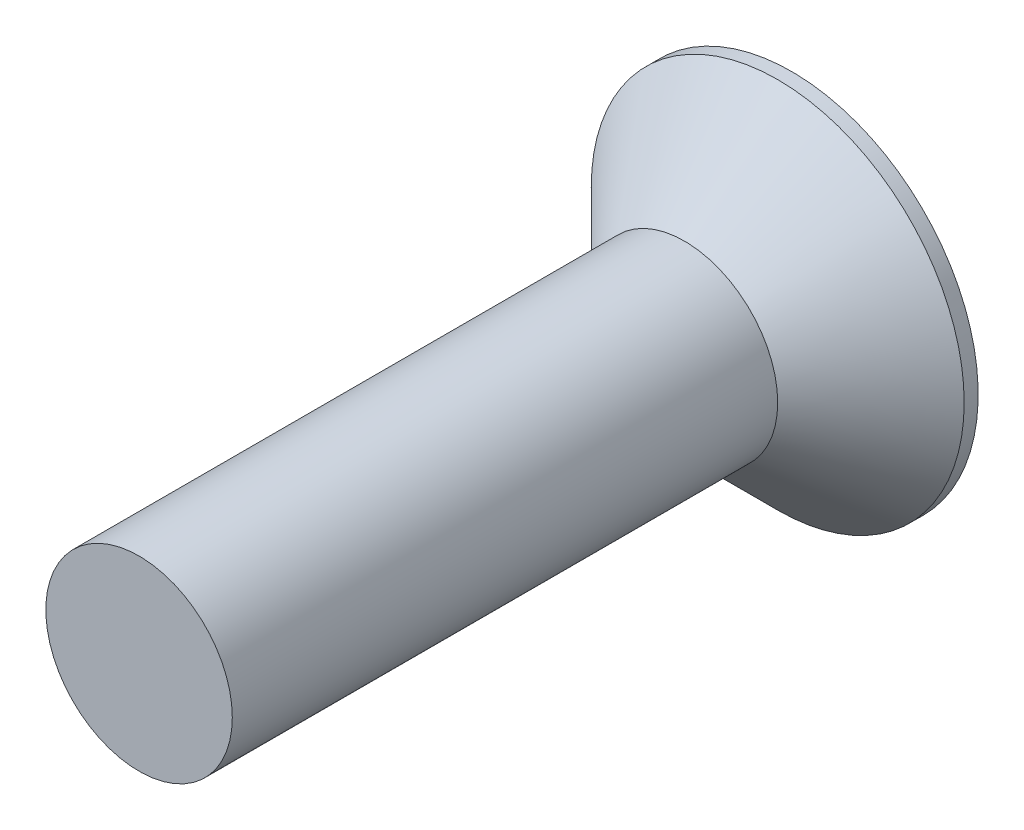
ISO-10303-21;
HEADER;
FILE_DESCRIPTION(('STEP AP214'),'2;1');
FILE_NAME('part.step','',(''),(''),'','','');
FILE_SCHEMA(('AUTOMOTIVE_DESIGN { 1 0 10303 214 1 1 1 1 }'));
ENDSEC;
DATA;
#1=APPLICATION_CONTEXT('core data for automotive mechanical design processes');
#2=APPLICATION_PROTOCOL_DEFINITION('international standard','automotive_design',2000,#1);
#3=PRODUCT_CONTEXT('',#1,'mechanical');
#4=PRODUCT('Part','Part','',(#3));
#5=PRODUCT_RELATED_PRODUCT_CATEGORY('part','',(#4));
#6=PRODUCT_DEFINITION_FORMATION('','',#4);
#7=PRODUCT_DEFINITION_CONTEXT('part definition',#1,'design');
#8=PRODUCT_DEFINITION('design','',#6,#7);
#9=PRODUCT_DEFINITION_SHAPE('','',#8);
#10=(LENGTH_UNIT() NAMED_UNIT(*) SI_UNIT(.MILLI.,.METRE.));
#11=(NAMED_UNIT(*) PLANE_ANGLE_UNIT() SI_UNIT($,.RADIAN.));
#12=(NAMED_UNIT(*) SI_UNIT($,.STERADIAN.) SOLID_ANGLE_UNIT());
#13=UNCERTAINTY_MEASURE_WITH_UNIT(LENGTH_MEASURE(1.E-05),#10,'distance_accuracy_value','');
#14=(GEOMETRIC_REPRESENTATION_CONTEXT(3) GLOBAL_UNCERTAINTY_ASSIGNED_CONTEXT((#13)) GLOBAL_UNIT_ASSIGNED_CONTEXT((#10,
#11,#12)) REPRESENTATION_CONTEXT('',''));
#15=CARTESIAN_POINT('',(0.,0.,0.));
#16=DIRECTION('',(0.,0.,1.));
#17=DIRECTION('',(1.,0.,0.));
#18=AXIS2_PLACEMENT_3D('',#15,#16,#17);
#19=CARTESIAN_POINT('',(0.,0.,-14.));
#20=DIRECTION('',(0.,0.,1.));
#21=DIRECTION('',(1.,0.,0.));
#22=AXIS2_PLACEMENT_3D('',#19,#20,#21);
#23=PLANE('',#22);
#24=CARTESIAN_POINT('',(0.,0.,-14.));
#25=DIRECTION('',(0.,0.,-1.));
#26=DIRECTION('',(-1.,0.,0.));
#27=AXIS2_PLACEMENT_3D('',#24,#25,#26);
#28=CIRCLE('',#27,4.);
#29=CARTESIAN_POINT('',(-4.,0.,-14.));
#30=VERTEX_POINT('',#29);
#31=EDGE_CURVE('E42',#30,#30,#28,.T.);
#32=ORIENTED_EDGE('',*,*,#31,.T.);
#33=EDGE_LOOP('',(#32));
#34=FACE_BOUND('',#33,.T.);
#35=DIRECTION('',(-0.866025403784439,0.5,0.));
#36=VECTOR('',#35,1.);
#37=CARTESIAN_POINT('',(1.25,0.721687836487034,-14.));
#38=LINE('',#37,#36);
#39=CARTESIAN_POINT('',(1.25,0.721687836487034,-14.));
#40=VERTEX_POINT('',#39);
#41=CARTESIAN_POINT('',(0.,1.44337567297406,-14.));
#42=VERTEX_POINT('',#41);
#43=EDGE_CURVE('E49',#40,#42,#38,.T.);
#44=ORIENTED_EDGE('',*,*,#43,.T.);
#45=DIRECTION('',(-0.866025403784439,-0.5,0.));
#46=VECTOR('',#45,1.);
#47=CARTESIAN_POINT('',(0.,1.44337567297406,-14.));
#48=LINE('',#47,#46);
#49=CARTESIAN_POINT('',(-1.25,0.721687836487032,-14.));
#50=VERTEX_POINT('',#49);
#51=EDGE_CURVE('E120',#42,#50,#48,.T.);
#52=ORIENTED_EDGE('',*,*,#51,.T.);
#53=DIRECTION('',(0.,-1.,0.));
#54=VECTOR('',#53,1.);
#55=CARTESIAN_POINT('',(-1.25,0.721687836487032,-14.));
#56=LINE('',#55,#54);
#57=CARTESIAN_POINT('',(-1.25,-0.721687836487032,-14.));
#58=VERTEX_POINT('',#57);
#59=EDGE_CURVE('E123',#50,#58,#56,.T.);
#60=ORIENTED_EDGE('',*,*,#59,.T.);
#61=DIRECTION('',(0.866025403784439,-0.5,0.));
#62=VECTOR('',#61,1.);
#63=CARTESIAN_POINT('',(-1.25,-0.721687836487032,-14.));
#64=LINE('',#63,#62);
#65=CARTESIAN_POINT('',(0.,-1.44337567297406,-14.));
#66=VERTEX_POINT('',#65);
#67=EDGE_CURVE('E126',#58,#66,#64,.T.);
#68=ORIENTED_EDGE('',*,*,#67,.T.);
#69=DIRECTION('',(0.866025403784439,0.5,0.));
#70=VECTOR('',#69,1.);
#71=CARTESIAN_POINT('',(0.,-1.44337567297406,-14.));
#72=LINE('',#71,#70);
#73=CARTESIAN_POINT('',(1.25,-0.721687836487033,-14.));
#74=VERTEX_POINT('',#73);
#75=EDGE_CURVE('E110',#66,#74,#72,.T.);
#76=ORIENTED_EDGE('',*,*,#75,.T.);
#77=DIRECTION('',(0.,1.,0.));
#78=VECTOR('',#77,1.);
#79=CARTESIAN_POINT('',(1.25,-0.721687836487033,-14.));
#80=LINE('',#79,#78);
#81=EDGE_CURVE('E129',#74,#40,#80,.T.);
#82=ORIENTED_EDGE('',*,*,#81,.T.);
#83=EDGE_LOOP('',(#44,#52,#60,#68,#76,#82));
#84=FACE_BOUND('',#83,.T.);
#85=ADVANCED_FACE('F34',(#34,#84),#23,.F.);
#86=CARTESIAN_POINT('',(0.,0.,-11.7));
#87=DIRECTION('',(0.,0.,-1.));
#88=DIRECTION('',(-1.,0.,0.));
#89=AXIS2_PLACEMENT_3D('',#86,#87,#88);
#90=CYLINDRICAL_SURFACE('',#89,4.);
#91=CARTESIAN_POINT('',(0.,0.,-13.7));
#92=DIRECTION('',(0.,0.,1.));
#93=DIRECTION('',(1.,0.,0.));
#94=AXIS2_PLACEMENT_3D('',#91,#92,#93);
#95=CIRCLE('',#94,4.);
#96=CARTESIAN_POINT('',(4.,0.,-13.7));
#97=VERTEX_POINT('',#96);
#98=EDGE_CURVE('E143',#97,#97,#95,.T.);
#99=ORIENTED_EDGE('',*,*,#98,.F.);
#100=EDGE_LOOP('',(#99));
#101=FACE_BOUND('',#100,.T.);
#102=ORIENTED_EDGE('',*,*,#31,.F.);
#103=EDGE_LOOP('',(#102));
#104=FACE_BOUND('',#103,.T.);
#105=ADVANCED_FACE('F150',(#101,#104),#90,.T.);
#106=CARTESIAN_POINT('',(0.,0.,-13.7));
#107=DIRECTION('',(0.,0.,-1.));
#108=DIRECTION('',(-1.,0.,0.));
#109=AXIS2_PLACEMENT_3D('',#106,#107,#108);
#110=CONICAL_SURFACE('',#109,4.,0.785398163397444);
#111=CARTESIAN_POINT('',(0.,0.,-11.7));
#112=DIRECTION('',(0.,0.,1.));
#113=DIRECTION('',(1.,0.,0.));
#114=AXIS2_PLACEMENT_3D('',#111,#112,#113);
#115=CIRCLE('',#114,2.);
#116=CARTESIAN_POINT('',(2.,0.,-11.7));
#117=VERTEX_POINT('',#116);
#118=EDGE_CURVE('E140',#117,#117,#115,.T.);
#119=ORIENTED_EDGE('',*,*,#118,.F.);
#120=EDGE_LOOP('',(#119));
#121=FACE_BOUND('',#120,.T.);
#122=ORIENTED_EDGE('',*,*,#98,.T.);
#123=EDGE_LOOP('',(#122));
#124=FACE_BOUND('',#123,.T.);
#125=ADVANCED_FACE('F152',(#121,#124),#110,.T.);
#126=CARTESIAN_POINT('',(0.,0.,0.));
#127=DIRECTION('',(0.,0.,1.));
#128=DIRECTION('',(1.,0.,0.));
#129=AXIS2_PLACEMENT_3D('',#126,#127,#128);
#130=PLANE('',#129);
#131=CARTESIAN_POINT('',(0.,0.,0.));
#132=DIRECTION('',(0.,0.,1.));
#133=DIRECTION('',(1.,0.,0.));
#134=AXIS2_PLACEMENT_3D('',#131,#132,#133);
#135=CIRCLE('',#134,2.);
#136=CARTESIAN_POINT('',(2.,0.,0.));
#137=VERTEX_POINT('',#136);
#138=EDGE_CURVE('E11',#137,#137,#135,.T.);
#139=ORIENTED_EDGE('',*,*,#138,.T.);
#140=EDGE_LOOP('',(#139));
#141=FACE_BOUND('',#140,.T.);
#142=ADVANCED_FACE('F159',(#141),#130,.T.);
#143=CARTESIAN_POINT('',(0.,0.,-14.));
#144=DIRECTION('',(0.,0.,1.));
#145=DIRECTION('',(1.,0.,0.));
#146=AXIS2_PLACEMENT_3D('',#143,#144,#145);
#147=CYLINDRICAL_SURFACE('',#146,2.);
#148=ORIENTED_EDGE('',*,*,#138,.F.);
#149=EDGE_LOOP('',(#148));
#150=FACE_BOUND('',#149,.T.);
#151=ORIENTED_EDGE('',*,*,#118,.T.);
#152=EDGE_LOOP('',(#151));
#153=FACE_BOUND('',#152,.T.);
#154=ADVANCED_FACE('F36',(#150,#153),#147,.T.);
#155=CARTESIAN_POINT('',(1.25,0.721687836487034,-12.125));
#156=DIRECTION('',(-0.5,-0.866025403784439,0.));
#157=DIRECTION('',(0.866025403784439,-0.5,0.));
#158=AXIS2_PLACEMENT_3D('',#155,#156,#157);
#159=PLANE('',#158);
#160=ORIENTED_EDGE('',*,*,#43,.F.);
#161=DIRECTION('',(0.,0.,-1.));
#162=VECTOR('',#161,1.);
#163=CARTESIAN_POINT('',(1.25,0.721687836487034,-12.125));
#164=LINE('',#163,#162);
#165=CARTESIAN_POINT('',(1.25,0.721687836487034,-12.125));
#166=VERTEX_POINT('',#165);
#167=EDGE_CURVE('E115',#166,#40,#164,.T.);
#168=ORIENTED_EDGE('',*,*,#167,.F.);
#169=DIRECTION('',(-0.866025403784439,0.5,0.));
#170=VECTOR('',#169,1.);
#171=CARTESIAN_POINT('',(1.25,0.721687836487034,-12.125));
#172=LINE('',#171,#170);
#173=CARTESIAN_POINT('',(0.,1.44337567297406,-12.125));
#174=VERTEX_POINT('',#173);
#175=EDGE_CURVE('E132',#166,#174,#172,.T.);
#176=ORIENTED_EDGE('',*,*,#175,.T.);
#177=DIRECTION('',(0.,0.,-1.));
#178=VECTOR('',#177,1.);
#179=CARTESIAN_POINT('',(0.,1.44337567297406,-12.125));
#180=LINE('',#179,#178);
#181=EDGE_CURVE('E138',#174,#42,#180,.T.);
#182=ORIENTED_EDGE('',*,*,#181,.T.);
#183=EDGE_LOOP('',(#160,#168,#176,#182));
#184=FACE_BOUND('',#183,.T.);
#185=ADVANCED_FACE('F170',(#184),#159,.T.);
#186=CARTESIAN_POINT('',(0.,1.44337567297406,-12.125));
#187=DIRECTION('',(0.5,-0.866025403784439,0.));
#188=DIRECTION('',(0.866025403784439,0.5,0.));
#189=AXIS2_PLACEMENT_3D('',#186,#187,#188);
#190=PLANE('',#189);
#191=ORIENTED_EDGE('',*,*,#51,.F.);
#192=ORIENTED_EDGE('',*,*,#181,.F.);
#193=DIRECTION('',(-0.866025403784439,-0.5,0.));
#194=VECTOR('',#193,1.);
#195=CARTESIAN_POINT('',(0.,1.44337567297406,-12.125));
#196=LINE('',#195,#194);
#197=CARTESIAN_POINT('',(-1.25,0.721687836487032,-12.125));
#198=VERTEX_POINT('',#197);
#199=EDGE_CURVE('E88',#174,#198,#196,.T.);
#200=ORIENTED_EDGE('',*,*,#199,.T.);
#201=DIRECTION('',(0.,0.,-1.));
#202=VECTOR('',#201,1.);
#203=CARTESIAN_POINT('',(-1.25,0.721687836487032,-12.125));
#204=LINE('',#203,#202);
#205=EDGE_CURVE('E136',#198,#50,#204,.T.);
#206=ORIENTED_EDGE('',*,*,#205,.T.);
#207=EDGE_LOOP('',(#191,#192,#200,#206));
#208=FACE_BOUND('',#207,.T.);
#209=ADVANCED_FACE('F179',(#208),#190,.T.);
#210=CARTESIAN_POINT('',(-1.25,0.721687836487032,-12.125));
#211=DIRECTION('',(1.,0.,0.));
#212=DIRECTION('',(0.,0.,-1.));
#213=AXIS2_PLACEMENT_3D('',#210,#211,#212);
#214=PLANE('',#213);
#215=ORIENTED_EDGE('',*,*,#59,.F.);
#216=ORIENTED_EDGE('',*,*,#205,.F.);
#217=DIRECTION('',(0.,-1.,0.));
#218=VECTOR('',#217,1.);
#219=CARTESIAN_POINT('',(-1.25,0.721687836487032,-12.125));
#220=LINE('',#219,#218);
#221=CARTESIAN_POINT('',(-1.25,-0.721687836487032,-12.125));
#222=VERTEX_POINT('',#221);
#223=EDGE_CURVE('E106',#198,#222,#220,.T.);
#224=ORIENTED_EDGE('',*,*,#223,.T.);
#225=DIRECTION('',(0.,0.,-1.));
#226=VECTOR('',#225,1.);
#227=CARTESIAN_POINT('',(-1.25,-0.721687836487032,-12.125));
#228=LINE('',#227,#226);
#229=EDGE_CURVE('E103',#222,#58,#228,.T.);
#230=ORIENTED_EDGE('',*,*,#229,.T.);
#231=EDGE_LOOP('',(#215,#216,#224,#230));
#232=FACE_BOUND('',#231,.T.);
#233=ADVANCED_FACE('F183',(#232),#214,.T.);
#234=CARTESIAN_POINT('',(-1.25,-0.721687836487032,-12.125));
#235=DIRECTION('',(0.5,0.866025403784439,0.));
#236=DIRECTION('',(-0.866025403784439,0.5,0.));
#237=AXIS2_PLACEMENT_3D('',#234,#235,#236);
#238=PLANE('',#237);
#239=ORIENTED_EDGE('',*,*,#67,.F.);
#240=ORIENTED_EDGE('',*,*,#229,.F.);
#241=DIRECTION('',(0.866025403784439,-0.5,0.));
#242=VECTOR('',#241,1.);
#243=CARTESIAN_POINT('',(-1.25,-0.721687836487032,-12.125));
#244=LINE('',#243,#242);
#245=CARTESIAN_POINT('',(0.,-1.44337567297406,-12.125));
#246=VERTEX_POINT('',#245);
#247=EDGE_CURVE('E98',#222,#246,#244,.T.);
#248=ORIENTED_EDGE('',*,*,#247,.T.);
#249=DIRECTION('',(0.,0.,-1.));
#250=VECTOR('',#249,1.);
#251=CARTESIAN_POINT('',(0.,-1.44337567297406,-12.125));
#252=LINE('',#251,#250);
#253=EDGE_CURVE('E102',#246,#66,#252,.T.);
#254=ORIENTED_EDGE('',*,*,#253,.T.);
#255=EDGE_LOOP('',(#239,#240,#248,#254));
#256=FACE_BOUND('',#255,.T.);
#257=ADVANCED_FACE('F101',(#256),#238,.T.);
#258=CARTESIAN_POINT('',(0.,-1.44337567297406,-12.125));
#259=DIRECTION('',(-0.5,0.866025403784439,0.));
#260=DIRECTION('',(-0.866025403784439,-0.5,0.));
#261=AXIS2_PLACEMENT_3D('',#258,#259,#260);
#262=PLANE('',#261);
#263=ORIENTED_EDGE('',*,*,#75,.F.);
#264=ORIENTED_EDGE('',*,*,#253,.F.);
#265=DIRECTION('',(0.866025403784439,0.5,0.));
#266=VECTOR('',#265,1.);
#267=CARTESIAN_POINT('',(0.,-1.44337567297406,-12.125));
#268=LINE('',#267,#266);
#269=CARTESIAN_POINT('',(1.25,-0.721687836487033,-12.125));
#270=VERTEX_POINT('',#269);
#271=EDGE_CURVE('E105',#246,#270,#268,.T.);
#272=ORIENTED_EDGE('',*,*,#271,.T.);
#273=DIRECTION('',(0.,0.,-1.));
#274=VECTOR('',#273,1.);
#275=CARTESIAN_POINT('',(1.25,-0.721687836487033,-12.125));
#276=LINE('',#275,#274);
#277=EDGE_CURVE('E79',#270,#74,#276,.T.);
#278=ORIENTED_EDGE('',*,*,#277,.T.);
#279=EDGE_LOOP('',(#263,#264,#272,#278));
#280=FACE_BOUND('',#279,.T.);
#281=ADVANCED_FACE('F108',(#280),#262,.T.);
#282=CARTESIAN_POINT('',(1.25,-0.721687836487033,-12.125));
#283=DIRECTION('',(-1.,0.,0.));
#284=DIRECTION('',(0.,-1.,0.));
#285=AXIS2_PLACEMENT_3D('',#282,#283,#284);
#286=PLANE('',#285);
#287=ORIENTED_EDGE('',*,*,#81,.F.);
#288=ORIENTED_EDGE('',*,*,#277,.F.);
#289=DIRECTION('',(0.,1.,0.));
#290=VECTOR('',#289,1.);
#291=CARTESIAN_POINT('',(1.25,-0.721687836487033,-12.125));
#292=LINE('',#291,#290);
#293=EDGE_CURVE('E57',#270,#166,#292,.T.);
#294=ORIENTED_EDGE('',*,*,#293,.T.);
#295=ORIENTED_EDGE('',*,*,#167,.T.);
#296=EDGE_LOOP('',(#287,#288,#294,#295));
#297=FACE_BOUND('',#296,.T.);
#298=ADVANCED_FACE('F194',(#297),#286,.T.);
#299=CARTESIAN_POINT('',(-1.25,2.1650635094611,-12.125));
#300=DIRECTION('',(0.,0.,1.));
#301=DIRECTION('',(1.,0.,0.));
#302=AXIS2_PLACEMENT_3D('',#299,#300,#301);
#303=PLANE('',#302);
#304=ORIENTED_EDGE('',*,*,#175,.F.);
#305=ORIENTED_EDGE('',*,*,#293,.F.);
#306=ORIENTED_EDGE('',*,*,#271,.F.);
#307=ORIENTED_EDGE('',*,*,#247,.F.);
#308=ORIENTED_EDGE('',*,*,#223,.F.);
#309=ORIENTED_EDGE('',*,*,#199,.F.);
#310=EDGE_LOOP('',(#304,#305,#306,#307,#308,#309));
#311=FACE_BOUND('',#310,.T.);
#312=ADVANCED_FACE('F113',(#311),#303,.F.);
#313=CLOSED_SHELL('',(#85,#105,#125,#142,#154,#185,#209,#233,#257,#281,#298,#312));
#314=MANIFOLD_SOLID_BREP('B2',#313);
#315=ADVANCED_BREP_SHAPE_REPRESENTATION('',(#18,#314),#14);
#316=SHAPE_DEFINITION_REPRESENTATION(#9,#315);
ENDSEC;
END-ISO-10303-21;
